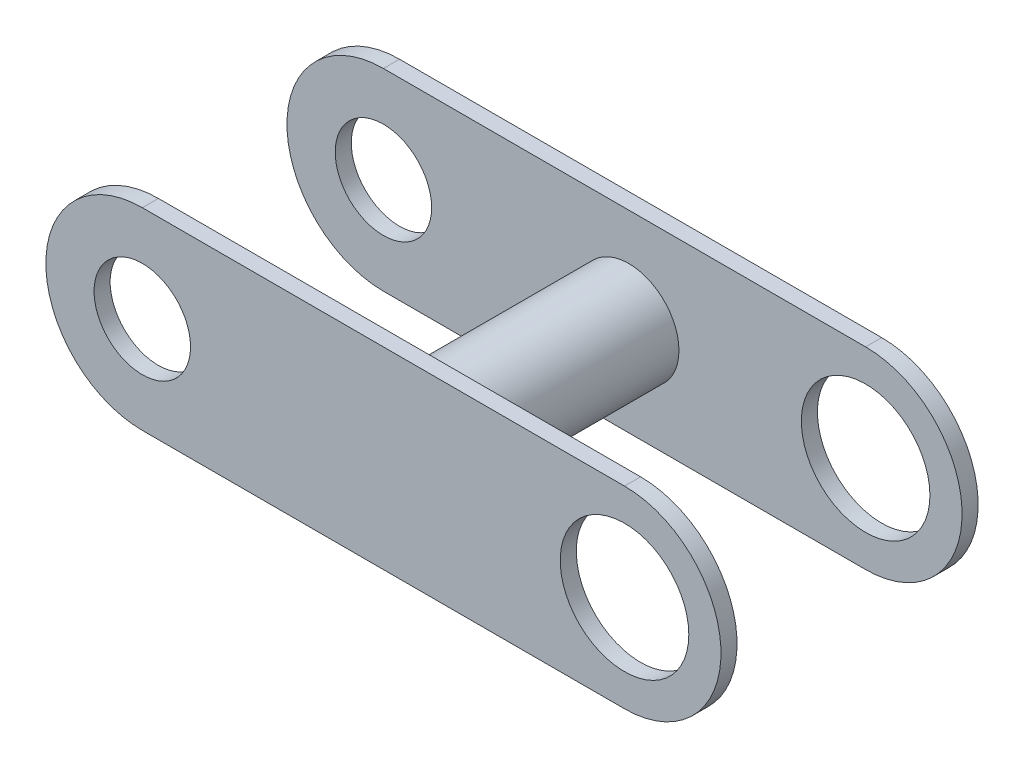
ISO-10303-21;
HEADER;
FILE_DESCRIPTION(('STEP AP214'),'2;1');
FILE_NAME('part.step','',(''),(''),'','','');
FILE_SCHEMA(('AUTOMOTIVE_DESIGN { 1 0 10303 214 1 1 1 1 }'));
ENDSEC;
DATA;
#1=APPLICATION_CONTEXT('core data for automotive mechanical design processes');
#2=APPLICATION_PROTOCOL_DEFINITION('international standard','automotive_design',2000,#1);
#3=PRODUCT_CONTEXT('',#1,'mechanical');
#4=PRODUCT('Part','Part','',(#3));
#5=PRODUCT_RELATED_PRODUCT_CATEGORY('part','',(#4));
#6=PRODUCT_DEFINITION_FORMATION('','',#4);
#7=PRODUCT_DEFINITION_CONTEXT('part definition',#1,'design');
#8=PRODUCT_DEFINITION('design','',#6,#7);
#9=PRODUCT_DEFINITION_SHAPE('','',#8);
#10=(LENGTH_UNIT() NAMED_UNIT(*) SI_UNIT(.MILLI.,.METRE.));
#11=(NAMED_UNIT(*) PLANE_ANGLE_UNIT() SI_UNIT($,.RADIAN.));
#12=(NAMED_UNIT(*) SI_UNIT($,.STERADIAN.) SOLID_ANGLE_UNIT());
#13=UNCERTAINTY_MEASURE_WITH_UNIT(LENGTH_MEASURE(1.E-05),#10,'distance_accuracy_value','');
#14=(GEOMETRIC_REPRESENTATION_CONTEXT(3) GLOBAL_UNCERTAINTY_ASSIGNED_CONTEXT((#13)) GLOBAL_UNIT_ASSIGNED_CONTEXT((#10,
#11,#12)) REPRESENTATION_CONTEXT('',''));
#15=CARTESIAN_POINT('',(0.,0.,0.));
#16=DIRECTION('',(0.,0.,1.));
#17=DIRECTION('',(1.,0.,0.));
#18=AXIS2_PLACEMENT_3D('',#15,#16,#17);
#19=CARTESIAN_POINT('',(-31.5987479192528,0.,5.));
#20=DIRECTION('',(0.,0.,1.));
#21=DIRECTION('',(1.,0.,0.));
#22=AXIS2_PLACEMENT_3D('',#19,#20,#21);
#23=PLANE('',#22);
#24=CARTESIAN_POINT('',(44.713404218723,0.,5.));
#25=DIRECTION('',(0.,0.,1.));
#26=DIRECTION('',(1.,0.,0.));
#27=AXIS2_PLACEMENT_3D('',#24,#25,#26);
#28=CIRCLE('',#27,15.619945806333);
#29=CARTESIAN_POINT('',(60.3333500250561,0.,5.));
#30=VERTEX_POINT('',#29);
#31=EDGE_CURVE('E140',#30,#30,#28,.T.);
#32=ORIENTED_EDGE('',*,*,#31,.F.);
#33=EDGE_LOOP('',(#32));
#34=FACE_BOUND('',#33,.T.);
#35=CARTESIAN_POINT('',(-31.5987479192528,0.,5.));
#36=DIRECTION('',(0.,0.,1.));
#37=DIRECTION('',(1.,0.,0.));
#38=AXIS2_PLACEMENT_3D('',#35,#36,#37);
#39=CIRCLE('',#38,15.);
#40=CARTESIAN_POINT('',(-16.5987479192528,0.,5.));
#41=VERTEX_POINT('',#40);
#42=EDGE_CURVE('E158',#41,#41,#39,.T.);
#43=ORIENTED_EDGE('',*,*,#42,.F.);
#44=EDGE_LOOP('',(#43));
#45=FACE_BOUND('',#44,.T.);
#46=CARTESIAN_POINT('',(-31.5987479192528,0.,5.));
#47=DIRECTION('',(0.,0.,1.));
#48=DIRECTION('',(1.,0.,0.));
#49=AXIS2_PLACEMENT_3D('',#46,#47,#48);
#50=CIRCLE('',#49,30.);
#51=CARTESIAN_POINT('',(-31.5987479192528,30.,5.));
#52=VERTEX_POINT('',#51);
#53=CARTESIAN_POINT('',(-31.5987479192528,-30.,5.));
#54=VERTEX_POINT('',#53);
#55=EDGE_CURVE('E164',#52,#54,#50,.T.);
#56=ORIENTED_EDGE('',*,*,#55,.T.);
#57=DIRECTION('',(1.,0.,0.));
#58=VECTOR('',#57,1.);
#59=CARTESIAN_POINT('',(-31.5987479192528,-30.,5.));
#60=LINE('',#59,#58);
#61=CARTESIAN_POINT('',(118.401252080747,-30.,5.));
#62=VERTEX_POINT('',#61);
#63=EDGE_CURVE('E87',#54,#62,#60,.T.);
#64=ORIENTED_EDGE('',*,*,#63,.T.);
#65=CARTESIAN_POINT('',(118.401252080747,0.,5.));
#66=DIRECTION('',(0.,0.,1.));
#67=DIRECTION('',(1.,0.,0.));
#68=AXIS2_PLACEMENT_3D('',#65,#66,#67);
#69=CIRCLE('',#68,30.);
#70=CARTESIAN_POINT('',(118.401252080747,30.,5.));
#71=VERTEX_POINT('',#70);
#72=EDGE_CURVE('E167',#62,#71,#69,.T.);
#73=ORIENTED_EDGE('',*,*,#72,.T.);
#74=DIRECTION('',(-1.,0.,0.));
#75=VECTOR('',#74,1.);
#76=CARTESIAN_POINT('',(-31.5987479192528,30.,5.));
#77=LINE('',#76,#75);
#78=EDGE_CURVE('E56',#71,#52,#77,.T.);
#79=ORIENTED_EDGE('',*,*,#78,.T.);
#80=EDGE_LOOP('',(#56,#64,#73,#79));
#81=FACE_BOUND('',#80,.T.);
#82=CARTESIAN_POINT('',(118.401252080747,0.,5.));
#83=DIRECTION('',(0.,0.,1.));
#84=DIRECTION('',(1.,0.,0.));
#85=AXIS2_PLACEMENT_3D('',#82,#83,#84);
#86=CIRCLE('',#85,20.);
#87=CARTESIAN_POINT('',(138.401252080747,0.,5.));
#88=VERTEX_POINT('',#87);
#89=EDGE_CURVE('E152',#88,#88,#86,.T.);
#90=ORIENTED_EDGE('',*,*,#89,.F.);
#91=EDGE_LOOP('',(#90));
#92=FACE_BOUND('',#91,.T.);
#93=ADVANCED_FACE('F39',(#34,#45,#81,#92),#23,.T.);
#94=CARTESIAN_POINT('',(-31.5987479192528,0.,0.));
#95=DIRECTION('',(0.,0.,1.));
#96=DIRECTION('',(1.,0.,0.));
#97=AXIS2_PLACEMENT_3D('',#94,#95,#96);
#98=PLANE('',#97);
#99=CARTESIAN_POINT('',(-31.5987479192528,0.,0.));
#100=DIRECTION('',(0.,0.,1.));
#101=DIRECTION('',(1.,0.,0.));
#102=AXIS2_PLACEMENT_3D('',#99,#100,#101);
#103=CIRCLE('',#102,30.);
#104=CARTESIAN_POINT('',(-31.5987479192528,30.,0.));
#105=VERTEX_POINT('',#104);
#106=CARTESIAN_POINT('',(-31.5987479192528,-30.,0.));
#107=VERTEX_POINT('',#106);
#108=EDGE_CURVE('E161',#105,#107,#103,.T.);
#109=ORIENTED_EDGE('',*,*,#108,.F.);
#110=DIRECTION('',(-1.,0.,0.));
#111=VECTOR('',#110,1.);
#112=CARTESIAN_POINT('',(-31.5987479192528,30.,0.));
#113=LINE('',#112,#111);
#114=CARTESIAN_POINT('',(118.401252080747,30.,0.));
#115=VERTEX_POINT('',#114);
#116=EDGE_CURVE('E80',#115,#105,#113,.T.);
#117=ORIENTED_EDGE('',*,*,#116,.F.);
#118=CARTESIAN_POINT('',(118.401252080747,0.,0.));
#119=DIRECTION('',(0.,0.,1.));
#120=DIRECTION('',(1.,0.,0.));
#121=AXIS2_PLACEMENT_3D('',#118,#119,#120);
#122=CIRCLE('',#121,30.);
#123=CARTESIAN_POINT('',(118.401252080747,-30.,0.));
#124=VERTEX_POINT('',#123);
#125=EDGE_CURVE('E74',#124,#115,#122,.T.);
#126=ORIENTED_EDGE('',*,*,#125,.F.);
#127=DIRECTION('',(1.,0.,0.));
#128=VECTOR('',#127,1.);
#129=CARTESIAN_POINT('',(-31.5987479192528,-30.,0.));
#130=LINE('',#129,#128);
#131=EDGE_CURVE('E173',#107,#124,#130,.T.);
#132=ORIENTED_EDGE('',*,*,#131,.F.);
#133=EDGE_LOOP('',(#109,#117,#126,#132));
#134=FACE_BOUND('',#133,.T.);
#135=CARTESIAN_POINT('',(-31.5987479192528,0.,0.));
#136=DIRECTION('',(0.,0.,1.));
#137=DIRECTION('',(1.,0.,0.));
#138=AXIS2_PLACEMENT_3D('',#135,#136,#137);
#139=CIRCLE('',#138,15.);
#140=CARTESIAN_POINT('',(-16.5987479192528,0.,0.));
#141=VERTEX_POINT('',#140);
#142=EDGE_CURVE('E155',#141,#141,#139,.T.);
#143=ORIENTED_EDGE('',*,*,#142,.T.);
#144=EDGE_LOOP('',(#143));
#145=FACE_BOUND('',#144,.T.);
#146=CARTESIAN_POINT('',(118.401252080747,0.,0.));
#147=DIRECTION('',(0.,0.,1.));
#148=DIRECTION('',(1.,0.,0.));
#149=AXIS2_PLACEMENT_3D('',#146,#147,#148);
#150=CIRCLE('',#149,20.);
#151=CARTESIAN_POINT('',(138.401252080747,0.,0.));
#152=VERTEX_POINT('',#151);
#153=EDGE_CURVE('E150',#152,#152,#150,.T.);
#154=ORIENTED_EDGE('',*,*,#153,.T.);
#155=EDGE_LOOP('',(#154));
#156=FACE_BOUND('',#155,.T.);
#157=ADVANCED_FACE('F183',(#134,#145,#156),#98,.F.);
#158=CARTESIAN_POINT('',(-31.5987479192528,0.,5.));
#159=DIRECTION('',(0.,0.,-1.));
#160=DIRECTION('',(-1.,0.,0.));
#161=AXIS2_PLACEMENT_3D('',#158,#159,#160);
#162=CYLINDRICAL_SURFACE('',#161,30.);
#163=ORIENTED_EDGE('',*,*,#108,.T.);
#164=DIRECTION('',(0.,0.,-1.));
#165=VECTOR('',#164,1.);
#166=CARTESIAN_POINT('',(-31.5987479192528,-30.,5.));
#167=LINE('',#166,#165);
#168=EDGE_CURVE('E11',#54,#107,#167,.T.);
#169=ORIENTED_EDGE('',*,*,#168,.F.);
#170=ORIENTED_EDGE('',*,*,#55,.F.);
#171=DIRECTION('',(0.,0.,-1.));
#172=VECTOR('',#171,1.);
#173=CARTESIAN_POINT('',(-31.5987479192528,30.,5.));
#174=LINE('',#173,#172);
#175=EDGE_CURVE('E170',#52,#105,#174,.T.);
#176=ORIENTED_EDGE('',*,*,#175,.T.);
#177=EDGE_LOOP('',(#163,#169,#170,#176));
#178=FACE_BOUND('',#177,.T.);
#179=ADVANCED_FACE('F41',(#178),#162,.T.);
#180=CARTESIAN_POINT('',(-31.5987479192528,-30.,5.));
#181=DIRECTION('',(0.,1.,0.));
#182=DIRECTION('',(0.,0.,1.));
#183=AXIS2_PLACEMENT_3D('',#180,#181,#182);
#184=PLANE('',#183);
#185=ORIENTED_EDGE('',*,*,#131,.T.);
#186=DIRECTION('',(0.,0.,-1.));
#187=VECTOR('',#186,1.);
#188=CARTESIAN_POINT('',(118.401252080747,-30.,5.));
#189=LINE('',#188,#187);
#190=EDGE_CURVE('E48',#62,#124,#189,.T.);
#191=ORIENTED_EDGE('',*,*,#190,.F.);
#192=ORIENTED_EDGE('',*,*,#63,.F.);
#193=ORIENTED_EDGE('',*,*,#168,.T.);
#194=EDGE_LOOP('',(#185,#191,#192,#193));
#195=FACE_BOUND('',#194,.T.);
#196=ADVANCED_FACE('F199',(#195),#184,.F.);
#197=CARTESIAN_POINT('',(118.401252080747,0.,5.));
#198=DIRECTION('',(0.,0.,-1.));
#199=DIRECTION('',(-1.,0.,0.));
#200=AXIS2_PLACEMENT_3D('',#197,#198,#199);
#201=CYLINDRICAL_SURFACE('',#200,30.);
#202=ORIENTED_EDGE('',*,*,#125,.T.);
#203=DIRECTION('',(0.,0.,-1.));
#204=VECTOR('',#203,1.);
#205=CARTESIAN_POINT('',(118.401252080747,30.,5.));
#206=LINE('',#205,#204);
#207=EDGE_CURVE('E178',#71,#115,#206,.T.);
#208=ORIENTED_EDGE('',*,*,#207,.F.);
#209=ORIENTED_EDGE('',*,*,#72,.F.);
#210=ORIENTED_EDGE('',*,*,#190,.T.);
#211=EDGE_LOOP('',(#202,#208,#209,#210));
#212=FACE_BOUND('',#211,.T.);
#213=ADVANCED_FACE('F180',(#212),#201,.T.);
#214=CARTESIAN_POINT('',(-31.5987479192528,30.,5.));
#215=DIRECTION('',(0.,-1.,0.));
#216=DIRECTION('',(0.,0.,-1.));
#217=AXIS2_PLACEMENT_3D('',#214,#215,#216);
#218=PLANE('',#217);
#219=ORIENTED_EDGE('',*,*,#116,.T.);
#220=ORIENTED_EDGE('',*,*,#175,.F.);
#221=ORIENTED_EDGE('',*,*,#78,.F.);
#222=ORIENTED_EDGE('',*,*,#207,.T.);
#223=EDGE_LOOP('',(#219,#220,#221,#222));
#224=FACE_BOUND('',#223,.T.);
#225=ADVANCED_FACE('F188',(#224),#218,.F.);
#226=CARTESIAN_POINT('',(-31.5987479192528,0.,5.));
#227=DIRECTION('',(0.,0.,-1.));
#228=DIRECTION('',(-1.,0.,0.));
#229=AXIS2_PLACEMENT_3D('',#226,#227,#228);
#230=CYLINDRICAL_SURFACE('',#229,15.);
#231=ORIENTED_EDGE('',*,*,#42,.T.);
#232=EDGE_LOOP('',(#231));
#233=FACE_BOUND('',#232,.T.);
#234=ORIENTED_EDGE('',*,*,#142,.F.);
#235=EDGE_LOOP('',(#234));
#236=FACE_BOUND('',#235,.T.);
#237=ADVANCED_FACE('F190',(#233,#236),#230,.F.);
#238=CARTESIAN_POINT('',(118.401252080747,0.,5.));
#239=DIRECTION('',(0.,0.,-1.));
#240=DIRECTION('',(-1.,0.,0.));
#241=AXIS2_PLACEMENT_3D('',#238,#239,#240);
#242=CYLINDRICAL_SURFACE('',#241,20.);
#243=ORIENTED_EDGE('',*,*,#89,.T.);
#244=EDGE_LOOP('',(#243));
#245=FACE_BOUND('',#244,.T.);
#246=ORIENTED_EDGE('',*,*,#153,.F.);
#247=EDGE_LOOP('',(#246));
#248=FACE_BOUND('',#247,.T.);
#249=ADVANCED_FACE('F196',(#245,#248),#242,.F.);
#250=CARTESIAN_POINT('',(44.713404218723,0.,75.));
#251=DIRECTION('',(0.,0.,-1.));
#252=DIRECTION('',(-1.,0.,0.));
#253=AXIS2_PLACEMENT_3D('',#250,#251,#252);
#254=CYLINDRICAL_SURFACE('',#253,15.619945806333);
#255=CARTESIAN_POINT('',(44.713404218723,0.,75.));
#256=DIRECTION('',(0.,0.,1.));
#257=DIRECTION('',(1.,0.,0.));
#258=AXIS2_PLACEMENT_3D('',#255,#256,#257);
#259=CIRCLE('',#258,15.619945806333);
#260=CARTESIAN_POINT('',(60.3333500250561,0.,75.));
#261=VERTEX_POINT('',#260);
#262=EDGE_CURVE('E143',#261,#261,#259,.T.);
#263=ORIENTED_EDGE('',*,*,#262,.F.);
#264=EDGE_LOOP('',(#263));
#265=FACE_BOUND('',#264,.T.);
#266=ORIENTED_EDGE('',*,*,#31,.T.);
#267=EDGE_LOOP('',(#266));
#268=FACE_BOUND('',#267,.T.);
#269=ADVANCED_FACE('F214',(#265,#268),#254,.T.);
#270=CARTESIAN_POINT('',(-31.5987479192528,0.,80.));
#271=DIRECTION('',(0.,0.,1.));
#272=DIRECTION('',(1.,0.,0.));
#273=AXIS2_PLACEMENT_3D('',#270,#271,#272);
#274=PLANE('',#273);
#275=CARTESIAN_POINT('',(-31.5987479192528,0.,80.));
#276=DIRECTION('',(0.,0.,1.));
#277=DIRECTION('',(1.,0.,0.));
#278=AXIS2_PLACEMENT_3D('',#275,#276,#277);
#279=CIRCLE('',#278,15.);
#280=CARTESIAN_POINT('',(-16.5987479192528,0.,80.));
#281=VERTEX_POINT('',#280);
#282=EDGE_CURVE('E258',#281,#281,#279,.T.);
#283=ORIENTED_EDGE('',*,*,#282,.F.);
#284=EDGE_LOOP('',(#283));
#285=FACE_BOUND('',#284,.T.);
#286=CARTESIAN_POINT('',(-31.5987479192528,0.,80.));
#287=DIRECTION('',(0.,0.,1.));
#288=DIRECTION('',(1.,0.,0.));
#289=AXIS2_PLACEMENT_3D('',#286,#287,#288);
#290=CIRCLE('',#289,30.);
#291=CARTESIAN_POINT('',(-31.5987479192528,30.,80.));
#292=VERTEX_POINT('',#291);
#293=CARTESIAN_POINT('',(-31.5987479192528,-30.,80.));
#294=VERTEX_POINT('',#293);
#295=EDGE_CURVE('E125',#292,#294,#290,.T.);
#296=ORIENTED_EDGE('',*,*,#295,.T.);
#297=DIRECTION('',(1.,0.,0.));
#298=VECTOR('',#297,1.);
#299=CARTESIAN_POINT('',(-31.5987479192528,-30.,80.));
#300=LINE('',#299,#298);
#301=CARTESIAN_POINT('',(118.401252080747,-30.,80.));
#302=VERTEX_POINT('',#301);
#303=EDGE_CURVE('E114',#294,#302,#300,.T.);
#304=ORIENTED_EDGE('',*,*,#303,.T.);
#305=CARTESIAN_POINT('',(118.401252080747,0.,80.));
#306=DIRECTION('',(0.,0.,1.));
#307=DIRECTION('',(1.,0.,0.));
#308=AXIS2_PLACEMENT_3D('',#305,#306,#307);
#309=CIRCLE('',#308,30.);
#310=CARTESIAN_POINT('',(118.401252080747,30.,80.));
#311=VERTEX_POINT('',#310);
#312=EDGE_CURVE('E124',#302,#311,#309,.T.);
#313=ORIENTED_EDGE('',*,*,#312,.T.);
#314=DIRECTION('',(-1.,0.,0.));
#315=VECTOR('',#314,1.);
#316=CARTESIAN_POINT('',(-31.5987479192528,30.,80.));
#317=LINE('',#316,#315);
#318=EDGE_CURVE('E131',#311,#292,#317,.T.);
#319=ORIENTED_EDGE('',*,*,#318,.T.);
#320=EDGE_LOOP('',(#296,#304,#313,#319));
#321=FACE_BOUND('',#320,.T.);
#322=CARTESIAN_POINT('',(118.401252080747,0.,80.));
#323=DIRECTION('',(0.,0.,1.));
#324=DIRECTION('',(1.,0.,0.));
#325=AXIS2_PLACEMENT_3D('',#322,#323,#324);
#326=CIRCLE('',#325,20.);
#327=CARTESIAN_POINT('',(138.401252080747,0.,80.));
#328=VERTEX_POINT('',#327);
#329=EDGE_CURVE('E249',#328,#328,#326,.T.);
#330=ORIENTED_EDGE('',*,*,#329,.F.);
#331=EDGE_LOOP('',(#330));
#332=FACE_BOUND('',#331,.T.);
#333=ADVANCED_FACE('F128',(#285,#321,#332),#274,.T.);
#334=CARTESIAN_POINT('',(-31.5987479192528,0.,75.));
#335=DIRECTION('',(0.,0.,1.));
#336=DIRECTION('',(1.,0.,0.));
#337=AXIS2_PLACEMENT_3D('',#334,#335,#336);
#338=PLANE('',#337);
#339=ORIENTED_EDGE('',*,*,#262,.T.);
#340=EDGE_LOOP('',(#339));
#341=FACE_BOUND('',#340,.T.);
#342=CARTESIAN_POINT('',(-31.5987479192528,0.,75.));
#343=DIRECTION('',(0.,0.,1.));
#344=DIRECTION('',(1.,0.,0.));
#345=AXIS2_PLACEMENT_3D('',#342,#343,#344);
#346=CIRCLE('',#345,30.);
#347=CARTESIAN_POINT('',(-31.5987479192528,30.,75.));
#348=VERTEX_POINT('',#347);
#349=CARTESIAN_POINT('',(-31.5987479192528,-30.,75.));
#350=VERTEX_POINT('',#349);
#351=EDGE_CURVE('E139',#348,#350,#346,.T.);
#352=ORIENTED_EDGE('',*,*,#351,.F.);
#353=DIRECTION('',(-1.,0.,0.));
#354=VECTOR('',#353,1.);
#355=CARTESIAN_POINT('',(-31.5987479192528,30.,75.));
#356=LINE('',#355,#354);
#357=CARTESIAN_POINT('',(118.401252080747,30.,75.));
#358=VERTEX_POINT('',#357);
#359=EDGE_CURVE('E135',#358,#348,#356,.T.);
#360=ORIENTED_EDGE('',*,*,#359,.F.);
#361=CARTESIAN_POINT('',(118.401252080747,0.,75.));
#362=DIRECTION('',(0.,0.,1.));
#363=DIRECTION('',(1.,0.,0.));
#364=AXIS2_PLACEMENT_3D('',#361,#362,#363);
#365=CIRCLE('',#364,30.);
#366=CARTESIAN_POINT('',(118.401252080747,-30.,75.));
#367=VERTEX_POINT('',#366);
#368=EDGE_CURVE('E269',#367,#358,#365,.T.);
#369=ORIENTED_EDGE('',*,*,#368,.F.);
#370=DIRECTION('',(1.,0.,0.));
#371=VECTOR('',#370,1.);
#372=CARTESIAN_POINT('',(-31.5987479192528,-30.,75.));
#373=LINE('',#372,#371);
#374=EDGE_CURVE('E267',#350,#367,#373,.T.);
#375=ORIENTED_EDGE('',*,*,#374,.F.);
#376=EDGE_LOOP('',(#352,#360,#369,#375));
#377=FACE_BOUND('',#376,.T.);
#378=CARTESIAN_POINT('',(-31.5987479192528,0.,75.));
#379=DIRECTION('',(0.,0.,1.));
#380=DIRECTION('',(1.,0.,0.));
#381=AXIS2_PLACEMENT_3D('',#378,#379,#380);
#382=CIRCLE('',#381,15.);
#383=CARTESIAN_POINT('',(-16.5987479192528,0.,75.));
#384=VERTEX_POINT('',#383);
#385=EDGE_CURVE('E255',#384,#384,#382,.T.);
#386=ORIENTED_EDGE('',*,*,#385,.T.);
#387=EDGE_LOOP('',(#386));
#388=FACE_BOUND('',#387,.T.);
#389=CARTESIAN_POINT('',(118.401252080747,0.,75.));
#390=DIRECTION('',(0.,0.,1.));
#391=DIRECTION('',(1.,0.,0.));
#392=AXIS2_PLACEMENT_3D('',#389,#390,#391);
#393=CIRCLE('',#392,20.);
#394=CARTESIAN_POINT('',(138.401252080747,0.,75.));
#395=VERTEX_POINT('',#394);
#396=EDGE_CURVE('E252',#395,#395,#393,.T.);
#397=ORIENTED_EDGE('',*,*,#396,.T.);
#398=EDGE_LOOP('',(#397));
#399=FACE_BOUND('',#398,.T.);
#400=ADVANCED_FACE('F220',(#341,#377,#388,#399),#338,.F.);
#401=CARTESIAN_POINT('',(-31.5987479192528,0.,80.));
#402=DIRECTION('',(0.,0.,-1.));
#403=DIRECTION('',(-1.,0.,0.));
#404=AXIS2_PLACEMENT_3D('',#401,#402,#403);
#405=CYLINDRICAL_SURFACE('',#404,30.);
#406=ORIENTED_EDGE('',*,*,#351,.T.);
#407=DIRECTION('',(0.,0.,-1.));
#408=VECTOR('',#407,1.);
#409=CARTESIAN_POINT('',(-31.5987479192528,-30.,80.));
#410=LINE('',#409,#408);
#411=EDGE_CURVE('E118',#294,#350,#410,.T.);
#412=ORIENTED_EDGE('',*,*,#411,.F.);
#413=ORIENTED_EDGE('',*,*,#295,.F.);
#414=DIRECTION('',(0.,0.,-1.));
#415=VECTOR('',#414,1.);
#416=CARTESIAN_POINT('',(-31.5987479192528,30.,80.));
#417=LINE('',#416,#415);
#418=EDGE_CURVE('E265',#292,#348,#417,.T.);
#419=ORIENTED_EDGE('',*,*,#418,.T.);
#420=EDGE_LOOP('',(#406,#412,#413,#419));
#421=FACE_BOUND('',#420,.T.);
#422=ADVANCED_FACE('F137',(#421),#405,.T.);
#423=CARTESIAN_POINT('',(-31.5987479192528,-30.,80.));
#424=DIRECTION('',(0.,1.,0.));
#425=DIRECTION('',(0.,0.,1.));
#426=AXIS2_PLACEMENT_3D('',#423,#424,#425);
#427=PLANE('',#426);
#428=ORIENTED_EDGE('',*,*,#374,.T.);
#429=DIRECTION('',(0.,0.,-1.));
#430=VECTOR('',#429,1.);
#431=CARTESIAN_POINT('',(118.401252080747,-30.,80.));
#432=LINE('',#431,#430);
#433=EDGE_CURVE('E121',#302,#367,#432,.T.);
#434=ORIENTED_EDGE('',*,*,#433,.F.);
#435=ORIENTED_EDGE('',*,*,#303,.F.);
#436=ORIENTED_EDGE('',*,*,#411,.T.);
#437=EDGE_LOOP('',(#428,#434,#435,#436));
#438=FACE_BOUND('',#437,.T.);
#439=ADVANCED_FACE('F116',(#438),#427,.F.);
#440=CARTESIAN_POINT('',(118.401252080747,0.,80.));
#441=DIRECTION('',(0.,0.,-1.));
#442=DIRECTION('',(-1.,0.,0.));
#443=AXIS2_PLACEMENT_3D('',#440,#441,#442);
#444=CYLINDRICAL_SURFACE('',#443,30.);
#445=ORIENTED_EDGE('',*,*,#368,.T.);
#446=DIRECTION('',(0.,0.,-1.));
#447=VECTOR('',#446,1.);
#448=CARTESIAN_POINT('',(118.401252080747,30.,80.));
#449=LINE('',#448,#447);
#450=EDGE_CURVE('E145',#311,#358,#449,.T.);
#451=ORIENTED_EDGE('',*,*,#450,.F.);
#452=ORIENTED_EDGE('',*,*,#312,.F.);
#453=ORIENTED_EDGE('',*,*,#433,.T.);
#454=EDGE_LOOP('',(#445,#451,#452,#453));
#455=FACE_BOUND('',#454,.T.);
#456=ADVANCED_FACE('F223',(#455),#444,.T.);
#457=CARTESIAN_POINT('',(-31.5987479192528,30.,80.));
#458=DIRECTION('',(0.,-1.,0.));
#459=DIRECTION('',(0.,0.,-1.));
#460=AXIS2_PLACEMENT_3D('',#457,#458,#459);
#461=PLANE('',#460);
#462=ORIENTED_EDGE('',*,*,#359,.T.);
#463=ORIENTED_EDGE('',*,*,#418,.F.);
#464=ORIENTED_EDGE('',*,*,#318,.F.);
#465=ORIENTED_EDGE('',*,*,#450,.T.);
#466=EDGE_LOOP('',(#462,#463,#464,#465));
#467=FACE_BOUND('',#466,.T.);
#468=ADVANCED_FACE('F226',(#467),#461,.F.);
#469=CARTESIAN_POINT('',(-31.5987479192528,0.,80.));
#470=DIRECTION('',(0.,0.,-1.));
#471=DIRECTION('',(-1.,0.,0.));
#472=AXIS2_PLACEMENT_3D('',#469,#470,#471);
#473=CYLINDRICAL_SURFACE('',#472,15.);
#474=ORIENTED_EDGE('',*,*,#282,.T.);
#475=EDGE_LOOP('',(#474));
#476=FACE_BOUND('',#475,.T.);
#477=ORIENTED_EDGE('',*,*,#385,.F.);
#478=EDGE_LOOP('',(#477));
#479=FACE_BOUND('',#478,.T.);
#480=ADVANCED_FACE('F230',(#476,#479),#473,.F.);
#481=CARTESIAN_POINT('',(118.401252080747,0.,80.));
#482=DIRECTION('',(0.,0.,-1.));
#483=DIRECTION('',(-1.,0.,0.));
#484=AXIS2_PLACEMENT_3D('',#481,#482,#483);
#485=CYLINDRICAL_SURFACE('',#484,20.);
#486=ORIENTED_EDGE('',*,*,#329,.T.);
#487=EDGE_LOOP('',(#486));
#488=FACE_BOUND('',#487,.T.);
#489=ORIENTED_EDGE('',*,*,#396,.F.);
#490=EDGE_LOOP('',(#489));
#491=FACE_BOUND('',#490,.T.);
#492=ADVANCED_FACE('F240',(#488,#491),#485,.F.);
#493=CLOSED_SHELL('',(#93,#157,#179,#196,#213,#225,#237,#249,#269,#333,#400,#422,#439,#456,#468,
#480,#492));
#494=MANIFOLD_SOLID_BREP('B2',#493);
#495=ADVANCED_BREP_SHAPE_REPRESENTATION('',(#18,#494),#14);
#496=SHAPE_DEFINITION_REPRESENTATION(#9,#495);
ENDSEC;
END-ISO-10303-21;
